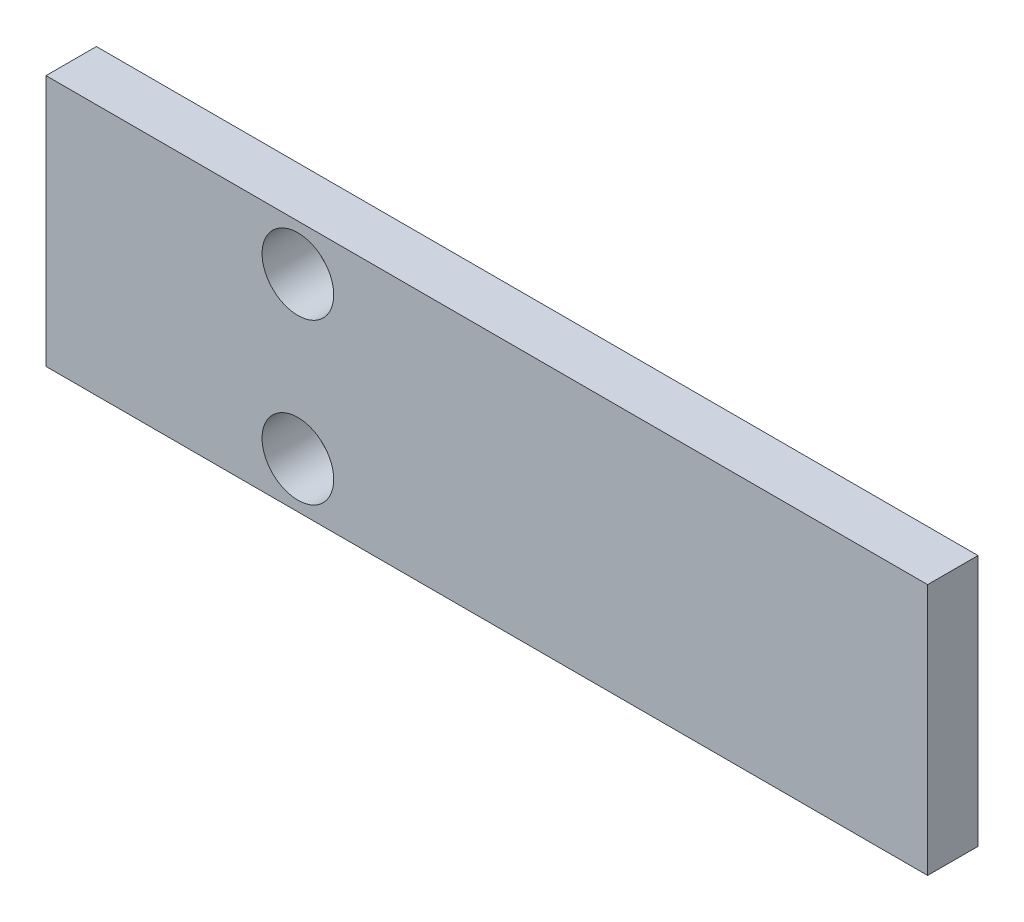
ISO-10303-21;
HEADER;
FILE_DESCRIPTION(('STEP AP214'),'2;1');
FILE_NAME('part.step','',(''),(''),'','','');
FILE_SCHEMA(('AUTOMOTIVE_DESIGN { 1 0 10303 214 1 1 1 1 }'));
ENDSEC;
DATA;
#1=APPLICATION_CONTEXT('core data for automotive mechanical design processes');
#2=APPLICATION_PROTOCOL_DEFINITION('international standard','automotive_design',2000,#1);
#3=PRODUCT_CONTEXT('',#1,'mechanical');
#4=PRODUCT('Part','Part','',(#3));
#5=PRODUCT_RELATED_PRODUCT_CATEGORY('part','',(#4));
#6=PRODUCT_DEFINITION_FORMATION('','',#4);
#7=PRODUCT_DEFINITION_CONTEXT('part definition',#1,'design');
#8=PRODUCT_DEFINITION('design','',#6,#7);
#9=PRODUCT_DEFINITION_SHAPE('','',#8);
#10=(LENGTH_UNIT() NAMED_UNIT(*) SI_UNIT(.MILLI.,.METRE.));
#11=(NAMED_UNIT(*) PLANE_ANGLE_UNIT() SI_UNIT($,.RADIAN.));
#12=(NAMED_UNIT(*) SI_UNIT($,.STERADIAN.) SOLID_ANGLE_UNIT());
#13=UNCERTAINTY_MEASURE_WITH_UNIT(LENGTH_MEASURE(1.E-05),#10,'distance_accuracy_value','');
#14=(GEOMETRIC_REPRESENTATION_CONTEXT(3) GLOBAL_UNCERTAINTY_ASSIGNED_CONTEXT((#13)) GLOBAL_UNIT_ASSIGNED_CONTEXT((#10,
#11,#12)) REPRESENTATION_CONTEXT('',''));
#15=CARTESIAN_POINT('',(0.,0.,0.));
#16=DIRECTION('',(0.,0.,1.));
#17=DIRECTION('',(1.,0.,0.));
#18=AXIS2_PLACEMENT_3D('',#15,#16,#17);
#19=CARTESIAN_POINT('',(17.5,-5.,2.));
#20=DIRECTION('',(-1.,0.,0.));
#21=DIRECTION('',(0.,0.,1.));
#22=AXIS2_PLACEMENT_3D('',#19,#20,#21);
#23=PLANE('',#22);
#24=DIRECTION('',(0.,1.,0.));
#25=VECTOR('',#24,1.);
#26=CARTESIAN_POINT('',(17.5,-5.,0.));
#27=LINE('',#26,#25);
#28=CARTESIAN_POINT('',(17.5,-5.,0.));
#29=VERTEX_POINT('',#28);
#30=CARTESIAN_POINT('',(17.5,5.,0.));
#31=VERTEX_POINT('',#30);
#32=EDGE_CURVE('E96',#29,#31,#27,.T.);
#33=ORIENTED_EDGE('',*,*,#32,.T.);
#34=DIRECTION('',(0.,0.,-1.));
#35=VECTOR('',#34,1.);
#36=CARTESIAN_POINT('',(17.5,5.,2.));
#37=LINE('',#36,#35);
#38=CARTESIAN_POINT('',(17.5,5.,2.));
#39=VERTEX_POINT('',#38);
#40=EDGE_CURVE('E11',#39,#31,#37,.T.);
#41=ORIENTED_EDGE('',*,*,#40,.F.);
#42=DIRECTION('',(0.,1.,0.));
#43=VECTOR('',#42,1.);
#44=CARTESIAN_POINT('',(17.5,-5.,2.));
#45=LINE('',#44,#43);
#46=CARTESIAN_POINT('',(17.5,-5.,2.));
#47=VERTEX_POINT('',#46);
#48=EDGE_CURVE('E84',#47,#39,#45,.T.);
#49=ORIENTED_EDGE('',*,*,#48,.F.);
#50=DIRECTION('',(0.,0.,-1.));
#51=VECTOR('',#50,1.);
#52=CARTESIAN_POINT('',(17.5,-5.,2.));
#53=LINE('',#52,#51);
#54=EDGE_CURVE('E92',#47,#29,#53,.T.);
#55=ORIENTED_EDGE('',*,*,#54,.T.);
#56=EDGE_LOOP('',(#33,#41,#49,#55));
#57=FACE_BOUND('',#56,.T.);
#58=ADVANCED_FACE('F33',(#57),#23,.F.);
#59=CARTESIAN_POINT('',(-17.5,5.,2.));
#60=DIRECTION('',(0.,-1.,0.));
#61=DIRECTION('',(0.,0.,-1.));
#62=AXIS2_PLACEMENT_3D('',#59,#60,#61);
#63=PLANE('',#62);
#64=DIRECTION('',(-1.,0.,0.));
#65=VECTOR('',#64,1.);
#66=CARTESIAN_POINT('',(-17.5,5.,0.));
#67=LINE('',#66,#65);
#68=CARTESIAN_POINT('',(-17.5,5.,0.));
#69=VERTEX_POINT('',#68);
#70=EDGE_CURVE('E88',#31,#69,#67,.T.);
#71=ORIENTED_EDGE('',*,*,#70,.T.);
#72=DIRECTION('',(0.,0.,-1.));
#73=VECTOR('',#72,1.);
#74=CARTESIAN_POINT('',(-17.5,5.,2.));
#75=LINE('',#74,#73);
#76=CARTESIAN_POINT('',(-17.5,5.,2.));
#77=VERTEX_POINT('',#76);
#78=EDGE_CURVE('E41',#77,#69,#75,.T.);
#79=ORIENTED_EDGE('',*,*,#78,.F.);
#80=DIRECTION('',(-1.,0.,0.));
#81=VECTOR('',#80,1.);
#82=CARTESIAN_POINT('',(-17.5,5.,2.));
#83=LINE('',#82,#81);
#84=EDGE_CURVE('E79',#39,#77,#83,.T.);
#85=ORIENTED_EDGE('',*,*,#84,.F.);
#86=ORIENTED_EDGE('',*,*,#40,.T.);
#87=EDGE_LOOP('',(#71,#79,#85,#86));
#88=FACE_BOUND('',#87,.T.);
#89=ADVANCED_FACE('F87',(#88),#63,.F.);
#90=CARTESIAN_POINT('',(-17.5,-5.,2.));
#91=DIRECTION('',(1.,0.,0.));
#92=DIRECTION('',(0.,0.,-1.));
#93=AXIS2_PLACEMENT_3D('',#90,#91,#92);
#94=PLANE('',#93);
#95=DIRECTION('',(0.,-1.,0.));
#96=VECTOR('',#95,1.);
#97=CARTESIAN_POINT('',(-17.5,-5.,0.));
#98=LINE('',#97,#96);
#99=CARTESIAN_POINT('',(-17.5,-5.,0.));
#100=VERTEX_POINT('',#99);
#101=EDGE_CURVE('E66',#69,#100,#98,.T.);
#102=ORIENTED_EDGE('',*,*,#101,.T.);
#103=DIRECTION('',(0.,0.,-1.));
#104=VECTOR('',#103,1.);
#105=CARTESIAN_POINT('',(-17.5,-5.,2.));
#106=LINE('',#105,#104);
#107=CARTESIAN_POINT('',(-17.5,-5.,2.));
#108=VERTEX_POINT('',#107);
#109=EDGE_CURVE('E89',#108,#100,#106,.T.);
#110=ORIENTED_EDGE('',*,*,#109,.F.);
#111=DIRECTION('',(0.,-1.,0.));
#112=VECTOR('',#111,1.);
#113=CARTESIAN_POINT('',(-17.5,-5.,2.));
#114=LINE('',#113,#112);
#115=EDGE_CURVE('E82',#77,#108,#114,.T.);
#116=ORIENTED_EDGE('',*,*,#115,.F.);
#117=ORIENTED_EDGE('',*,*,#78,.T.);
#118=EDGE_LOOP('',(#102,#110,#116,#117));
#119=FACE_BOUND('',#118,.T.);
#120=ADVANCED_FACE('F90',(#119),#94,.F.);
#121=CARTESIAN_POINT('',(-17.5,-5.,2.));
#122=DIRECTION('',(0.,1.,0.));
#123=DIRECTION('',(0.,0.,1.));
#124=AXIS2_PLACEMENT_3D('',#121,#122,#123);
#125=PLANE('',#124);
#126=DIRECTION('',(1.,0.,0.));
#127=VECTOR('',#126,1.);
#128=CARTESIAN_POINT('',(-17.5,-5.,0.));
#129=LINE('',#128,#127);
#130=EDGE_CURVE('E72',#100,#29,#129,.T.);
#131=ORIENTED_EDGE('',*,*,#130,.T.);
#132=ORIENTED_EDGE('',*,*,#54,.F.);
#133=DIRECTION('',(1.,0.,0.));
#134=VECTOR('',#133,1.);
#135=CARTESIAN_POINT('',(-17.5,-5.,2.));
#136=LINE('',#135,#134);
#137=EDGE_CURVE('E49',#108,#47,#136,.T.);
#138=ORIENTED_EDGE('',*,*,#137,.F.);
#139=ORIENTED_EDGE('',*,*,#109,.T.);
#140=EDGE_LOOP('',(#131,#132,#138,#139));
#141=FACE_BOUND('',#140,.T.);
#142=ADVANCED_FACE('F104',(#141),#125,.F.);
#143=CARTESIAN_POINT('',(0.,0.,2.));
#144=DIRECTION('',(0.,0.,-1.));
#145=DIRECTION('',(-1.,0.,0.));
#146=AXIS2_PLACEMENT_3D('',#143,#144,#145);
#147=PLANE('',#146);
#148=CARTESIAN_POINT('',(-7.50000000000008,3.17499999999986,2.));
#149=DIRECTION('',(0.,0.,1.));
#150=DIRECTION('',(1.,0.,0.));
#151=AXIS2_PLACEMENT_3D('',#148,#149,#150);
#152=CIRCLE('',#151,1.42240000000001);
#153=CARTESIAN_POINT('',(-6.07760000000007,3.17499999999986,2.));
#154=VERTEX_POINT('',#153);
#155=EDGE_CURVE('E99',#154,#154,#152,.T.);
#156=ORIENTED_EDGE('',*,*,#155,.F.);
#157=EDGE_LOOP('',(#156));
#158=FACE_BOUND('',#157,.T.);
#159=CARTESIAN_POINT('',(-7.50000000000002,-3.17500000000014,2.));
#160=DIRECTION('',(0.,0.,1.));
#161=DIRECTION('',(1.,0.,0.));
#162=AXIS2_PLACEMENT_3D('',#159,#160,#161);
#163=CIRCLE('',#162,1.42240000000001);
#164=CARTESIAN_POINT('',(-6.07760000000001,-3.17500000000014,2.));
#165=VERTEX_POINT('',#164);
#166=EDGE_CURVE('E113',#165,#165,#163,.T.);
#167=ORIENTED_EDGE('',*,*,#166,.F.);
#168=EDGE_LOOP('',(#167));
#169=FACE_BOUND('',#168,.T.);
#170=ORIENTED_EDGE('',*,*,#48,.T.);
#171=ORIENTED_EDGE('',*,*,#84,.T.);
#172=ORIENTED_EDGE('',*,*,#115,.T.);
#173=ORIENTED_EDGE('',*,*,#137,.T.);
#174=EDGE_LOOP('',(#170,#171,#172,#173));
#175=FACE_BOUND('',#174,.T.);
#176=ADVANCED_FACE('F80',(#158,#169,#175),#147,.F.);
#177=CARTESIAN_POINT('',(0.,0.,0.));
#178=DIRECTION('',(0.,0.,-1.));
#179=DIRECTION('',(-1.,0.,0.));
#180=AXIS2_PLACEMENT_3D('',#177,#178,#179);
#181=PLANE('',#180);
#182=CARTESIAN_POINT('',(-7.50000000000008,3.17499999999986,0.));
#183=DIRECTION('',(0.,0.,-1.));
#184=DIRECTION('',(-1.,0.,0.));
#185=AXIS2_PLACEMENT_3D('',#182,#183,#184);
#186=CIRCLE('',#185,1.42240000000001);
#187=CARTESIAN_POINT('',(-8.92240000000009,3.17499999999986,0.));
#188=VERTEX_POINT('',#187);
#189=EDGE_CURVE('E116',#188,#188,#186,.F.);
#190=ORIENTED_EDGE('',*,*,#189,.T.);
#191=EDGE_LOOP('',(#190));
#192=FACE_BOUND('',#191,.T.);
#193=CARTESIAN_POINT('',(-7.50000000000002,-3.17500000000014,0.));
#194=DIRECTION('',(0.,0.,-1.));
#195=DIRECTION('',(-1.,0.,0.));
#196=AXIS2_PLACEMENT_3D('',#193,#194,#195);
#197=CIRCLE('',#196,1.42240000000001);
#198=CARTESIAN_POINT('',(-8.92240000000002,-3.17500000000014,0.));
#199=VERTEX_POINT('',#198);
#200=EDGE_CURVE('E110',#199,#199,#197,.F.);
#201=ORIENTED_EDGE('',*,*,#200,.T.);
#202=EDGE_LOOP('',(#201));
#203=FACE_BOUND('',#202,.T.);
#204=ORIENTED_EDGE('',*,*,#32,.F.);
#205=ORIENTED_EDGE('',*,*,#130,.F.);
#206=ORIENTED_EDGE('',*,*,#101,.F.);
#207=ORIENTED_EDGE('',*,*,#70,.F.);
#208=EDGE_LOOP('',(#204,#205,#206,#207));
#209=FACE_BOUND('',#208,.T.);
#210=ADVANCED_FACE('F107',(#192,#203,#209),#181,.T.);
#211=CARTESIAN_POINT('',(-7.50000000000002,-3.17500000000014,-0.00100000000000013));
#212=DIRECTION('',(0.,0.,1.));
#213=DIRECTION('',(1.,0.,0.));
#214=AXIS2_PLACEMENT_3D('',#211,#212,#213);
#215=CYLINDRICAL_SURFACE('',#214,1.42240000000001);
#216=ORIENTED_EDGE('',*,*,#200,.F.);
#217=EDGE_LOOP('',(#216));
#218=FACE_BOUND('',#217,.T.);
#219=ORIENTED_EDGE('',*,*,#166,.T.);
#220=EDGE_LOOP('',(#219));
#221=FACE_BOUND('',#220,.T.);
#222=ADVANCED_FACE('F129',(#218,#221),#215,.F.);
#223=CARTESIAN_POINT('',(-7.50000000000008,3.17499999999986,-0.00100000000000013));
#224=DIRECTION('',(0.,0.,1.));
#225=DIRECTION('',(1.,0.,0.));
#226=AXIS2_PLACEMENT_3D('',#223,#224,#225);
#227=CYLINDRICAL_SURFACE('',#226,1.42240000000001);
#228=ORIENTED_EDGE('',*,*,#189,.F.);
#229=EDGE_LOOP('',(#228));
#230=FACE_BOUND('',#229,.T.);
#231=ORIENTED_EDGE('',*,*,#155,.T.);
#232=EDGE_LOOP('',(#231));
#233=FACE_BOUND('',#232,.T.);
#234=ADVANCED_FACE('F122',(#230,#233),#227,.F.);
#235=CLOSED_SHELL('',(#58,#89,#120,#142,#176,#210,#222,#234));
#236=MANIFOLD_SOLID_BREP('B2',#235);
#237=ADVANCED_BREP_SHAPE_REPRESENTATION('',(#18,#236),#14);
#238=SHAPE_DEFINITION_REPRESENTATION(#9,#237);
ENDSEC;
END-ISO-10303-21;
